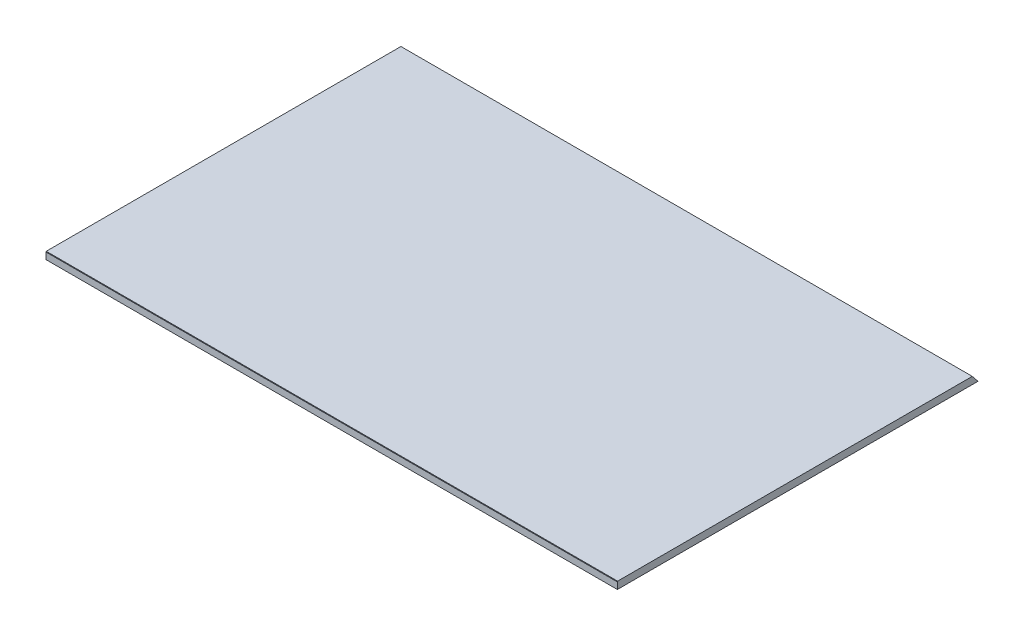
ISO-10303-21;
HEADER;
FILE_DESCRIPTION(('STEP AP214'),'2;1');
FILE_NAME('part.step','',(''),(''),'','','');
FILE_SCHEMA(('AUTOMOTIVE_DESIGN { 1 0 10303 214 1 1 1 1 }'));
ENDSEC;
DATA;
#1=APPLICATION_CONTEXT('core data for automotive mechanical design processes');
#2=APPLICATION_PROTOCOL_DEFINITION('international standard','automotive_design',2000,#1);
#3=PRODUCT_CONTEXT('',#1,'mechanical');
#4=PRODUCT('Part','Part','',(#3));
#5=PRODUCT_RELATED_PRODUCT_CATEGORY('part','',(#4));
#6=PRODUCT_DEFINITION_FORMATION('','',#4);
#7=PRODUCT_DEFINITION_CONTEXT('part definition',#1,'design');
#8=PRODUCT_DEFINITION('design','',#6,#7);
#9=PRODUCT_DEFINITION_SHAPE('','',#8);
#10=(LENGTH_UNIT() NAMED_UNIT(*) SI_UNIT(.MILLI.,.METRE.));
#11=(NAMED_UNIT(*) PLANE_ANGLE_UNIT() SI_UNIT($,.RADIAN.));
#12=(NAMED_UNIT(*) SI_UNIT($,.STERADIAN.) SOLID_ANGLE_UNIT());
#13=UNCERTAINTY_MEASURE_WITH_UNIT(LENGTH_MEASURE(1.E-05),#10,'distance_accuracy_value','');
#14=(GEOMETRIC_REPRESENTATION_CONTEXT(3) GLOBAL_UNCERTAINTY_ASSIGNED_CONTEXT((#13)) GLOBAL_UNIT_ASSIGNED_CONTEXT((#10,
#11,#12)) REPRESENTATION_CONTEXT('',''));
#15=CARTESIAN_POINT('',(0.,0.,0.));
#16=DIRECTION('',(0.,0.,1.));
#17=DIRECTION('',(1.,0.,0.));
#18=AXIS2_PLACEMENT_3D('',#15,#16,#17);
#19=CARTESIAN_POINT('',(-133.,-8.0000000000001,104.1040803328));
#20=DIRECTION('',(-1.,0.,0.));
#21=DIRECTION('',(0.,0.,1.));
#22=AXIS2_PLACEMENT_3D('',#19,#20,#21);
#23=PLANE('',#22);
#24=DIRECTION('',(0.,0.250277466762177,0.968174152532027));
#25=VECTOR('',#24,1.);
#26=CARTESIAN_POINT('',(-133.,-6.12527762073789,103.619455984239));
#27=LINE('',#26,#25);
#28=CARTESIAN_POINT('',(-133.,-8.0000000000001,96.3672739390223));
#29=VERTEX_POINT('',#28);
#30=CARTESIAN_POINT('',(-133.,-6.0000000000001,104.1040803328));
#31=VERTEX_POINT('',#30);
#32=EDGE_CURVE('E469',#29,#31,#27,.T.);
#33=ORIENTED_EDGE('',*,*,#32,.F.);
#34=DIRECTION('',(0.,0.,1.));
#35=VECTOR('',#34,1.);
#36=CARTESIAN_POINT('',(-133.,-8.0000000000001,104.1040803328));
#37=LINE('',#36,#35);
#38=CARTESIAN_POINT('',(-133.,-8.0000000000001,87.3672739390223));
#39=VERTEX_POINT('',#38);
#40=EDGE_CURVE('E293',#39,#29,#37,.T.);
#41=ORIENTED_EDGE('',*,*,#40,.F.);
#42=DIRECTION('',(0.,0.304193173014902,-0.952610368141732));
#43=VECTOR('',#42,1.);
#44=CARTESIAN_POINT('',(-133.,-12.8499510952522,102.55536528416));
#45=LINE('',#44,#43);
#46=CARTESIAN_POINT('',(-133.,-6.0000000000001,81.1040803327998));
#47=VERTEX_POINT('',#46);
#48=EDGE_CURVE('E56',#39,#47,#45,.T.);
#49=ORIENTED_EDGE('',*,*,#48,.T.);
#50=DIRECTION('',(0.,0.,1.));
#51=VECTOR('',#50,1.);
#52=CARTESIAN_POINT('',(-133.,-6.0000000000001,104.1040803328));
#53=LINE('',#52,#51);
#54=EDGE_CURVE('E284',#47,#31,#53,.T.);
#55=ORIENTED_EDGE('',*,*,#54,.T.);
#56=EDGE_LOOP('',(#33,#41,#49,#55));
#57=FACE_BOUND('',#56,.T.);
#58=ADVANCED_FACE('F33',(#57),#23,.F.);
#59=CARTESIAN_POINT('',(-140.,-8.0000000000001,104.1040803328));
#60=DIRECTION('',(1.,0.,0.));
#61=DIRECTION('',(0.,0.,-1.));
#62=AXIS2_PLACEMENT_3D('',#59,#60,#61);
#63=PLANE('',#62);
#64=DIRECTION('',(0.,-0.250277466762177,-0.968174152532027));
#65=VECTOR('',#64,1.);
#66=CARTESIAN_POINT('',(-140.,-6.12527762073789,103.619455984239));
#67=LINE('',#66,#65);
#68=CARTESIAN_POINT('',(-140.,-6.0000000000001,104.1040803328));
#69=VERTEX_POINT('',#68);
#70=CARTESIAN_POINT('',(-140.,-8.0000000000001,96.3672739390223));
#71=VERTEX_POINT('',#70);
#72=EDGE_CURVE('E48',#69,#71,#67,.T.);
#73=ORIENTED_EDGE('',*,*,#72,.F.);
#74=DIRECTION('',(0.,0.,-1.));
#75=VECTOR('',#74,1.);
#76=CARTESIAN_POINT('',(-140.,-6.0000000000001,104.1040803328));
#77=LINE('',#76,#75);
#78=CARTESIAN_POINT('',(-140.,-6.0000000000001,81.1040803327998));
#79=VERTEX_POINT('',#78);
#80=EDGE_CURVE('E305',#69,#79,#77,.T.);
#81=ORIENTED_EDGE('',*,*,#80,.T.);
#82=DIRECTION('',(0.,-0.304193173014902,0.952610368141732));
#83=VECTOR('',#82,1.);
#84=CARTESIAN_POINT('',(-140.,-12.8499510952522,102.55536528416));
#85=LINE('',#84,#83);
#86=CARTESIAN_POINT('',(-140.,-8.0000000000001,87.3672739390223));
#87=VERTEX_POINT('',#86);
#88=EDGE_CURVE('E243',#79,#87,#85,.T.);
#89=ORIENTED_EDGE('',*,*,#88,.T.);
#90=DIRECTION('',(0.,0.,-1.));
#91=VECTOR('',#90,1.);
#92=CARTESIAN_POINT('',(-140.,-8.0000000000001,104.1040803328));
#93=LINE('',#92,#91);
#94=EDGE_CURVE('E296',#71,#87,#93,.T.);
#95=ORIENTED_EDGE('',*,*,#94,.F.);
#96=EDGE_LOOP('',(#73,#81,#89,#95));
#97=FACE_BOUND('',#96,.T.);
#98=ADVANCED_FACE('F503',(#97),#63,.F.);
#99=CARTESIAN_POINT('',(0.,-8.0000000000001,0.));
#100=DIRECTION('',(0.,-1.,0.));
#101=DIRECTION('',(0.,0.,-1.));
#102=AXIS2_PLACEMENT_3D('',#99,#100,#101);
#103=PLANE('',#102);
#104=ORIENTED_EDGE('',*,*,#40,.T.);
#105=DIRECTION('',(-1.,0.,0.));
#106=VECTOR('',#105,1.);
#107=CARTESIAN_POINT('',(160.,-8.0000000000001,96.3672739390223));
#108=LINE('',#107,#106);
#109=EDGE_CURVE('E456',#29,#71,#108,.T.);
#110=ORIENTED_EDGE('',*,*,#109,.T.);
#111=ORIENTED_EDGE('',*,*,#94,.T.);
#112=DIRECTION('',(-1.,0.,0.));
#113=VECTOR('',#112,1.);
#114=CARTESIAN_POINT('',(160.,-8.0000000000001,87.3672739390223));
#115=LINE('',#114,#113);
#116=EDGE_CURVE('E486',#39,#87,#115,.T.);
#117=ORIENTED_EDGE('',*,*,#116,.F.);
#118=EDGE_LOOP('',(#104,#110,#111,#117));
#119=FACE_BOUND('',#118,.T.);
#120=ADVANCED_FACE('F496',(#119),#103,.T.);
#121=CARTESIAN_POINT('',(140.,-8.0000000000001,-37.8959196672003));
#122=DIRECTION('',(-1.,0.,0.));
#123=DIRECTION('',(0.,0.,1.));
#124=AXIS2_PLACEMENT_3D('',#121,#122,#123);
#125=PLANE('',#124);
#126=DIRECTION('',(0.,0.,1.));
#127=VECTOR('',#126,1.);
#128=CARTESIAN_POINT('',(140.,-8.0000000000001,-37.8959196672003));
#129=LINE('',#128,#127);
#130=CARTESIAN_POINT('',(140.,-8.0000000000001,-54.2234138343922));
#131=VERTEX_POINT('',#130);
#132=CARTESIAN_POINT('',(140.,-8.0000000000001,-45.2234138343922));
#133=VERTEX_POINT('',#132);
#134=EDGE_CURVE('E277',#131,#133,#129,.T.);
#135=ORIENTED_EDGE('',*,*,#134,.F.);
#136=DIRECTION('',(0.,0.287117162806241,-0.957895471761974));
#137=VECTOR('',#136,1.);
#138=CARTESIAN_POINT('',(140.,-12.4905218230525,-39.2418973060576));
#139=LINE('',#138,#137);
#140=CARTESIAN_POINT('',(140.,-6.0000000000001,-60.8959196672003));
#141=VERTEX_POINT('',#140);
#142=EDGE_CURVE('E249',#131,#141,#139,.T.);
#143=ORIENTED_EDGE('',*,*,#142,.T.);
#144=DIRECTION('',(0.,0.,1.));
#145=VECTOR('',#144,1.);
#146=CARTESIAN_POINT('',(140.,-6.0000000000001,-37.8959196672003));
#147=LINE('',#146,#145);
#148=CARTESIAN_POINT('',(140.,-6.0000000000001,-37.8959196672003));
#149=VERTEX_POINT('',#148);
#150=EDGE_CURVE('E267',#141,#149,#147,.T.);
#151=ORIENTED_EDGE('',*,*,#150,.T.);
#152=DIRECTION('',(0.,0.263312547903878,0.964710579457056));
#153=VECTOR('',#152,1.);
#154=CARTESIAN_POINT('',(140.,-6.13866699576736,-38.4039604685336));
#155=LINE('',#154,#153);
#156=EDGE_CURVE('E436',#133,#149,#155,.T.);
#157=ORIENTED_EDGE('',*,*,#156,.F.);
#158=EDGE_LOOP('',(#135,#143,#151,#157));
#159=FACE_BOUND('',#158,.T.);
#160=ADVANCED_FACE('F494',(#159),#125,.F.);
#161=CARTESIAN_POINT('',(133.,-8.0000000000001,-37.8959196672003));
#162=DIRECTION('',(1.,0.,0.));
#163=DIRECTION('',(0.,0.,-1.));
#164=AXIS2_PLACEMENT_3D('',#161,#162,#163);
#165=PLANE('',#164);
#166=DIRECTION('',(0.,0.,-1.));
#167=VECTOR('',#166,1.);
#168=CARTESIAN_POINT('',(133.,-6.0000000000001,-37.8959196672003));
#169=LINE('',#168,#167);
#170=CARTESIAN_POINT('',(133.,-6.0000000000001,-37.8959196672003));
#171=VERTEX_POINT('',#170);
#172=CARTESIAN_POINT('',(133.,-6.0000000000001,-60.8959196672003));
#173=VERTEX_POINT('',#172);
#174=EDGE_CURVE('E289',#171,#173,#169,.T.);
#175=ORIENTED_EDGE('',*,*,#174,.T.);
#176=DIRECTION('',(0.,-0.287117162806241,0.957895471761974));
#177=VECTOR('',#176,1.);
#178=CARTESIAN_POINT('',(133.,-12.4905218230525,-39.2418973060576));
#179=LINE('',#178,#177);
#180=CARTESIAN_POINT('',(133.,-8.0000000000001,-54.2234138343922));
#181=VERTEX_POINT('',#180);
#182=EDGE_CURVE('E253',#173,#181,#179,.T.);
#183=ORIENTED_EDGE('',*,*,#182,.T.);
#184=DIRECTION('',(0.,0.,-1.));
#185=VECTOR('',#184,1.);
#186=CARTESIAN_POINT('',(133.,-8.0000000000001,-37.8959196672003));
#187=LINE('',#186,#185);
#188=CARTESIAN_POINT('',(133.,-8.0000000000001,-45.2234138343922));
#189=VERTEX_POINT('',#188);
#190=EDGE_CURVE('E280',#189,#181,#187,.T.);
#191=ORIENTED_EDGE('',*,*,#190,.F.);
#192=DIRECTION('',(0.,-0.263312547903878,-0.964710579457056));
#193=VECTOR('',#192,1.);
#194=CARTESIAN_POINT('',(133.,-6.13866699576736,-38.4039604685336));
#195=LINE('',#194,#193);
#196=EDGE_CURVE('E440',#171,#189,#195,.T.);
#197=ORIENTED_EDGE('',*,*,#196,.F.);
#198=EDGE_LOOP('',(#175,#183,#191,#197));
#199=FACE_BOUND('',#198,.T.);
#200=ADVANCED_FACE('F487',(#199),#165,.F.);
#201=CARTESIAN_POINT('',(0.,-8.0000000000001,0.));
#202=DIRECTION('',(0.,1.,0.));
#203=DIRECTION('',(0.,0.,1.));
#204=AXIS2_PLACEMENT_3D('',#201,#202,#203);
#205=PLANE('',#204);
#206=ORIENTED_EDGE('',*,*,#190,.T.);
#207=DIRECTION('',(-1.,0.,0.));
#208=VECTOR('',#207,1.);
#209=CARTESIAN_POINT('',(160.,-8.0000000000001,-54.2234138343922));
#210=LINE('',#209,#208);
#211=EDGE_CURVE('E454',#131,#181,#210,.T.);
#212=ORIENTED_EDGE('',*,*,#211,.F.);
#213=ORIENTED_EDGE('',*,*,#134,.T.);
#214=DIRECTION('',(-1.,0.,0.));
#215=VECTOR('',#214,1.);
#216=CARTESIAN_POINT('',(160.,-8.0000000000001,-45.2234138343922));
#217=LINE('',#216,#215);
#218=EDGE_CURVE('E459',#133,#189,#217,.T.);
#219=ORIENTED_EDGE('',*,*,#218,.T.);
#220=EDGE_LOOP('',(#206,#212,#213,#219));
#221=FACE_BOUND('',#220,.T.);
#222=ADVANCED_FACE('F483',(#221),#205,.F.);
#223=CARTESIAN_POINT('',(-133.,-8.0000000000001,-37.8959196672003));
#224=DIRECTION('',(-1.,0.,0.));
#225=DIRECTION('',(0.,0.,1.));
#226=AXIS2_PLACEMENT_3D('',#223,#224,#225);
#227=PLANE('',#226);
#228=DIRECTION('',(0.,0.,1.));
#229=VECTOR('',#228,1.);
#230=CARTESIAN_POINT('',(-133.,-8.0000000000001,-37.8959196672003));
#231=LINE('',#230,#229);
#232=CARTESIAN_POINT('',(-133.,-8.0000000000001,-54.2234138343922));
#233=VERTEX_POINT('',#232);
#234=CARTESIAN_POINT('',(-133.,-8.0000000000001,-45.2234138343922));
#235=VERTEX_POINT('',#234);
#236=EDGE_CURVE('E260',#233,#235,#231,.T.);
#237=ORIENTED_EDGE('',*,*,#236,.F.);
#238=DIRECTION('',(0.,0.287117162806241,-0.957895471761974));
#239=VECTOR('',#238,1.);
#240=CARTESIAN_POINT('',(-133.,-12.4905218230525,-39.2418973060576));
#241=LINE('',#240,#239);
#242=CARTESIAN_POINT('',(-133.,-6.0000000000001,-60.8959196672003));
#243=VERTEX_POINT('',#242);
#244=EDGE_CURVE('E435',#233,#243,#241,.T.);
#245=ORIENTED_EDGE('',*,*,#244,.T.);
#246=DIRECTION('',(0.,0.,1.));
#247=VECTOR('',#246,1.);
#248=CARTESIAN_POINT('',(-133.,-6.0000000000001,-37.8959196672003));
#249=LINE('',#248,#247);
#250=CARTESIAN_POINT('',(-133.,-6.0000000000001,-37.8959196672003));
#251=VERTEX_POINT('',#250);
#252=EDGE_CURVE('E268',#243,#251,#249,.T.);
#253=ORIENTED_EDGE('',*,*,#252,.T.);
#254=DIRECTION('',(0.,0.263312547903878,0.964710579457056));
#255=VECTOR('',#254,1.);
#256=CARTESIAN_POINT('',(-133.,-6.13866699576736,-38.4039604685336));
#257=LINE('',#256,#255);
#258=EDGE_CURVE('E472',#235,#251,#257,.T.);
#259=ORIENTED_EDGE('',*,*,#258,.F.);
#260=EDGE_LOOP('',(#237,#245,#253,#259));
#261=FACE_BOUND('',#260,.T.);
#262=ADVANCED_FACE('F719',(#261),#227,.F.);
#263=CARTESIAN_POINT('',(-140.,-8.0000000000001,-37.8959196672003));
#264=DIRECTION('',(1.,0.,0.));
#265=DIRECTION('',(0.,0.,-1.));
#266=AXIS2_PLACEMENT_3D('',#263,#264,#265);
#267=PLANE('',#266);
#268=DIRECTION('',(0.,0.,-1.));
#269=VECTOR('',#268,1.);
#270=CARTESIAN_POINT('',(-140.,-6.0000000000001,-37.8959196672003));
#271=LINE('',#270,#269);
#272=CARTESIAN_POINT('',(-140.,-6.0000000000001,-37.8959196672003));
#273=VERTEX_POINT('',#272);
#274=CARTESIAN_POINT('',(-140.,-6.0000000000001,-60.8959196672003));
#275=VERTEX_POINT('',#274);
#276=EDGE_CURVE('E273',#273,#275,#271,.T.);
#277=ORIENTED_EDGE('',*,*,#276,.T.);
#278=DIRECTION('',(0.,-0.287117162806241,0.957895471761974));
#279=VECTOR('',#278,1.);
#280=CARTESIAN_POINT('',(-140.,-12.4905218230525,-39.2418973060576));
#281=LINE('',#280,#279);
#282=CARTESIAN_POINT('',(-140.,-8.0000000000001,-54.2234138343922));
#283=VERTEX_POINT('',#282);
#284=EDGE_CURVE('E432',#275,#283,#281,.T.);
#285=ORIENTED_EDGE('',*,*,#284,.T.);
#286=DIRECTION('',(0.,0.,-1.));
#287=VECTOR('',#286,1.);
#288=CARTESIAN_POINT('',(-140.,-8.0000000000001,-37.8959196672003));
#289=LINE('',#288,#287);
#290=CARTESIAN_POINT('',(-140.,-8.0000000000001,-45.2234138343922));
#291=VERTEX_POINT('',#290);
#292=EDGE_CURVE('E263',#291,#283,#289,.T.);
#293=ORIENTED_EDGE('',*,*,#292,.F.);
#294=DIRECTION('',(0.,-0.263312547903878,-0.964710579457056));
#295=VECTOR('',#294,1.);
#296=CARTESIAN_POINT('',(-140.,-6.13866699576736,-38.4039604685336));
#297=LINE('',#296,#295);
#298=EDGE_CURVE('E430',#273,#291,#297,.T.);
#299=ORIENTED_EDGE('',*,*,#298,.F.);
#300=EDGE_LOOP('',(#277,#285,#293,#299));
#301=FACE_BOUND('',#300,.T.);
#302=ADVANCED_FACE('F429',(#301),#267,.F.);
#303=CARTESIAN_POINT('',(0.,-8.0000000000001,0.));
#304=DIRECTION('',(0.,-1.,0.));
#305=DIRECTION('',(0.,0.,-1.));
#306=AXIS2_PLACEMENT_3D('',#303,#304,#305);
#307=PLANE('',#306);
#308=DIRECTION('',(-1.,0.,0.));
#309=VECTOR('',#308,1.);
#310=CARTESIAN_POINT('',(0.,-8.0000000000001,-54.2234138343922));
#311=LINE('',#310,#309);
#312=EDGE_CURVE('E11',#233,#283,#311,.T.);
#313=ORIENTED_EDGE('',*,*,#312,.F.);
#314=ORIENTED_EDGE('',*,*,#236,.T.);
#315=DIRECTION('',(-1.,0.,0.));
#316=VECTOR('',#315,1.);
#317=CARTESIAN_POINT('',(0.,-8.0000000000001,-45.2234138343922));
#318=LINE('',#317,#316);
#319=EDGE_CURVE('E41',#235,#291,#318,.T.);
#320=ORIENTED_EDGE('',*,*,#319,.T.);
#321=ORIENTED_EDGE('',*,*,#292,.T.);
#322=EDGE_LOOP('',(#313,#314,#320,#321));
#323=FACE_BOUND('',#322,.T.);
#324=ADVANCED_FACE('F422',(#323),#307,.T.);
#325=CARTESIAN_POINT('',(140.,-8.0000000000001,104.1040803328));
#326=DIRECTION('',(-1.,0.,0.));
#327=DIRECTION('',(0.,0.,1.));
#328=AXIS2_PLACEMENT_3D('',#325,#326,#327);
#329=PLANE('',#328);
#330=DIRECTION('',(0.,0.250277466762177,0.968174152532027));
#331=VECTOR('',#330,1.);
#332=CARTESIAN_POINT('',(140.,-6.12527762073789,103.619455984239));
#333=LINE('',#332,#331);
#334=CARTESIAN_POINT('',(140.,-8.0000000000001,96.3672739390223));
#335=VERTEX_POINT('',#334);
#336=CARTESIAN_POINT('',(140.,-6.0000000000001,104.1040803328));
#337=VERTEX_POINT('',#336);
#338=EDGE_CURVE('E466',#335,#337,#333,.T.);
#339=ORIENTED_EDGE('',*,*,#338,.F.);
#340=DIRECTION('',(0.,0.,1.));
#341=VECTOR('',#340,1.);
#342=CARTESIAN_POINT('',(140.,-8.0000000000001,104.1040803328));
#343=LINE('',#342,#341);
#344=CARTESIAN_POINT('',(140.,-8.0000000000001,87.3672739390223));
#345=VERTEX_POINT('',#344);
#346=EDGE_CURVE('E233',#345,#335,#343,.T.);
#347=ORIENTED_EDGE('',*,*,#346,.F.);
#348=DIRECTION('',(0.,0.304193173014902,-0.952610368141732));
#349=VECTOR('',#348,1.);
#350=CARTESIAN_POINT('',(140.,-12.8499510952522,102.55536528416));
#351=LINE('',#350,#349);
#352=CARTESIAN_POINT('',(140.,-6.0000000000001,81.1040803327998));
#353=VERTEX_POINT('',#352);
#354=EDGE_CURVE('E225',#345,#353,#351,.T.);
#355=ORIENTED_EDGE('',*,*,#354,.T.);
#356=DIRECTION('',(0.,0.,1.));
#357=VECTOR('',#356,1.);
#358=CARTESIAN_POINT('',(140.,-6.0000000000001,104.1040803328));
#359=LINE('',#358,#357);
#360=EDGE_CURVE('E241',#353,#337,#359,.T.);
#361=ORIENTED_EDGE('',*,*,#360,.T.);
#362=EDGE_LOOP('',(#339,#347,#355,#361));
#363=FACE_BOUND('',#362,.T.);
#364=ADVANCED_FACE('F240',(#363),#329,.F.);
#365=CARTESIAN_POINT('',(133.,-8.0000000000001,104.1040803328));
#366=DIRECTION('',(1.,0.,0.));
#367=DIRECTION('',(0.,0.,-1.));
#368=AXIS2_PLACEMENT_3D('',#365,#366,#367);
#369=PLANE('',#368);
#370=DIRECTION('',(0.,-0.250277466762177,-0.968174152532027));
#371=VECTOR('',#370,1.);
#372=CARTESIAN_POINT('',(133.,-6.12527762073789,103.619455984239));
#373=LINE('',#372,#371);
#374=CARTESIAN_POINT('',(133.,-6.0000000000001,104.1040803328));
#375=VERTEX_POINT('',#374);
#376=CARTESIAN_POINT('',(133.,-8.0000000000001,96.3672739390223));
#377=VERTEX_POINT('',#376);
#378=EDGE_CURVE('E453',#375,#377,#373,.T.);
#379=ORIENTED_EDGE('',*,*,#378,.F.);
#380=DIRECTION('',(0.,0.,-1.));
#381=VECTOR('',#380,1.);
#382=CARTESIAN_POINT('',(133.,-6.0000000000001,104.1040803328));
#383=LINE('',#382,#381);
#384=CARTESIAN_POINT('',(133.,-6.0000000000001,81.1040803327998));
#385=VERTEX_POINT('',#384);
#386=EDGE_CURVE('E234',#375,#385,#383,.T.);
#387=ORIENTED_EDGE('',*,*,#386,.T.);
#388=DIRECTION('',(0.,-0.304193173014902,0.952610368141732));
#389=VECTOR('',#388,1.);
#390=CARTESIAN_POINT('',(133.,-12.8499510952522,102.55536528416));
#391=LINE('',#390,#389);
#392=CARTESIAN_POINT('',(133.,-8.0000000000001,87.3672739390223));
#393=VERTEX_POINT('',#392);
#394=EDGE_CURVE('E228',#385,#393,#391,.T.);
#395=ORIENTED_EDGE('',*,*,#394,.T.);
#396=DIRECTION('',(0.,0.,-1.));
#397=VECTOR('',#396,1.);
#398=CARTESIAN_POINT('',(133.,-8.0000000000001,104.1040803328));
#399=LINE('',#398,#397);
#400=EDGE_CURVE('E256',#377,#393,#399,.T.);
#401=ORIENTED_EDGE('',*,*,#400,.F.);
#402=EDGE_LOOP('',(#379,#387,#395,#401));
#403=FACE_BOUND('',#402,.T.);
#404=ADVANCED_FACE('F452',(#403),#369,.F.);
#405=CARTESIAN_POINT('',(0.,-8.0000000000001,0.));
#406=DIRECTION('',(0.,1.,0.));
#407=DIRECTION('',(0.,0.,1.));
#408=AXIS2_PLACEMENT_3D('',#405,#406,#407);
#409=PLANE('',#408);
#410=DIRECTION('',(1.,0.,0.));
#411=VECTOR('',#410,1.);
#412=CARTESIAN_POINT('',(0.,-8.0000000000001,96.3672739390223));
#413=LINE('',#412,#411);
#414=EDGE_CURVE('E417',#377,#335,#413,.T.);
#415=ORIENTED_EDGE('',*,*,#414,.F.);
#416=ORIENTED_EDGE('',*,*,#400,.T.);
#417=DIRECTION('',(1.,0.,0.));
#418=VECTOR('',#417,1.);
#419=CARTESIAN_POINT('',(0.,-8.0000000000001,87.3672739390223));
#420=LINE('',#419,#418);
#421=EDGE_CURVE('E415',#393,#345,#420,.T.);
#422=ORIENTED_EDGE('',*,*,#421,.T.);
#423=ORIENTED_EDGE('',*,*,#346,.T.);
#424=EDGE_LOOP('',(#415,#416,#422,#423));
#425=FACE_BOUND('',#424,.T.);
#426=ADVANCED_FACE('F449',(#425),#409,.F.);
#427=CARTESIAN_POINT('',(160.,-6.0000000000001,88.1040803327998));
#428=DIRECTION('',(0.,1.,0.));
#429=DIRECTION('',(0.,0.,1.));
#430=AXIS2_PLACEMENT_3D('',#427,#428,#429);
#431=PLANE('',#430);
#432=DIRECTION('',(1.,0.,0.));
#433=VECTOR('',#432,1.);
#434=CARTESIAN_POINT('',(-140.,-6.0000000000001,-60.8959196672003));
#435=LINE('',#434,#433);
#436=EDGE_CURVE('E264',#275,#243,#435,.T.);
#437=ORIENTED_EDGE('',*,*,#436,.F.);
#438=ORIENTED_EDGE('',*,*,#276,.F.);
#439=DIRECTION('',(-1.,0.,0.));
#440=VECTOR('',#439,1.);
#441=CARTESIAN_POINT('',(-140.,-6.0000000000001,-37.8959196672003));
#442=LINE('',#441,#440);
#443=EDGE_CURVE('E271',#251,#273,#442,.T.);
#444=ORIENTED_EDGE('',*,*,#443,.F.);
#445=ORIENTED_EDGE('',*,*,#252,.F.);
#446=EDGE_LOOP('',(#437,#438,#444,#445));
#447=FACE_BOUND('',#446,.T.);
#448=DIRECTION('',(1.,0.,0.));
#449=VECTOR('',#448,1.);
#450=CARTESIAN_POINT('',(140.,-6.0000000000001,-60.8959196672003));
#451=LINE('',#450,#449);
#452=EDGE_CURVE('E281',#173,#141,#451,.T.);
#453=ORIENTED_EDGE('',*,*,#452,.F.);
#454=ORIENTED_EDGE('',*,*,#174,.F.);
#455=DIRECTION('',(-1.,0.,0.));
#456=VECTOR('',#455,1.);
#457=CARTESIAN_POINT('',(140.,-6.0000000000001,-37.8959196672003));
#458=LINE('',#457,#456);
#459=EDGE_CURVE('E287',#149,#171,#458,.T.);
#460=ORIENTED_EDGE('',*,*,#459,.F.);
#461=ORIENTED_EDGE('',*,*,#150,.F.);
#462=EDGE_LOOP('',(#453,#454,#460,#461));
#463=FACE_BOUND('',#462,.T.);
#464=DIRECTION('',(-1.,0.,0.));
#465=VECTOR('',#464,1.);
#466=CARTESIAN_POINT('',(140.,-6.0000000000001,104.1040803328));
#467=LINE('',#466,#465);
#468=EDGE_CURVE('E248',#337,#375,#467,.T.);
#469=ORIENTED_EDGE('',*,*,#468,.F.);
#470=ORIENTED_EDGE('',*,*,#360,.F.);
#471=DIRECTION('',(1.,0.,0.));
#472=VECTOR('',#471,1.);
#473=CARTESIAN_POINT('',(140.,-6.0000000000001,81.1040803327998));
#474=LINE('',#473,#472);
#475=EDGE_CURVE('E222',#385,#353,#474,.T.);
#476=ORIENTED_EDGE('',*,*,#475,.F.);
#477=ORIENTED_EDGE('',*,*,#386,.F.);
#478=EDGE_LOOP('',(#469,#470,#476,#477));
#479=FACE_BOUND('',#478,.T.);
#480=DIRECTION('',(-1.,0.,0.));
#481=VECTOR('',#480,1.);
#482=CARTESIAN_POINT('',(-140.,-6.0000000000001,104.1040803328));
#483=LINE('',#482,#481);
#484=EDGE_CURVE('E303',#31,#69,#483,.T.);
#485=ORIENTED_EDGE('',*,*,#484,.F.);
#486=ORIENTED_EDGE('',*,*,#54,.F.);
#487=DIRECTION('',(1.,0.,0.));
#488=VECTOR('',#487,1.);
#489=CARTESIAN_POINT('',(-140.,-6.0000000000001,81.1040803327998));
#490=LINE('',#489,#488);
#491=EDGE_CURVE('E297',#79,#47,#490,.T.);
#492=ORIENTED_EDGE('',*,*,#491,.F.);
#493=ORIENTED_EDGE('',*,*,#80,.F.);
#494=EDGE_LOOP('',(#485,#486,#492,#493));
#495=FACE_BOUND('',#494,.T.);
#496=DIRECTION('',(-1.,0.,0.));
#497=VECTOR('',#496,1.);
#498=CARTESIAN_POINT('',(160.,-6.0000000000001,106.1040803328));
#499=LINE('',#498,#497);
#500=CARTESIAN_POINT('',(142.,-6.00000000000008,106.1040803328));
#501=VERTEX_POINT('',#500);
#502=CARTESIAN_POINT('',(-142.,-6.0000000000001,106.1040803328));
#503=VERTEX_POINT('',#502);
#504=EDGE_CURVE('E392',#501,#503,#499,.T.);
#505=ORIENTED_EDGE('',*,*,#504,.T.);
#506=DIRECTION('',(0.,0.,1.));
#507=VECTOR('',#506,1.);
#508=CARTESIAN_POINT('',(-142.,-6.0000000000001,-82.7813178460502));
#509=LINE('',#508,#507);
#510=CARTESIAN_POINT('',(-142.,-6.0000000000001,-62.8959196671999));
#511=VERTEX_POINT('',#510);
#512=EDGE_CURVE('E341',#511,#503,#509,.T.);
#513=ORIENTED_EDGE('',*,*,#512,.F.);
#514=DIRECTION('',(-1.,0.,0.));
#515=VECTOR('',#514,1.);
#516=CARTESIAN_POINT('',(160.,-6.0000000000001,-62.8959196672002));
#517=LINE('',#516,#515);
#518=CARTESIAN_POINT('',(142.,-6.00000000000008,-62.8959196672003));
#519=VERTEX_POINT('',#518);
#520=EDGE_CURVE('E389',#519,#511,#517,.T.);
#521=ORIENTED_EDGE('',*,*,#520,.F.);
#522=DIRECTION('',(0.,0.,1.));
#523=VECTOR('',#522,1.);
#524=CARTESIAN_POINT('',(142.,-6.00000000000008,-82.7813178460502));
#525=LINE('',#524,#523);
#526=EDGE_CURVE('E333',#519,#501,#525,.T.);
#527=ORIENTED_EDGE('',*,*,#526,.T.);
#528=EDGE_LOOP('',(#505,#513,#521,#527));
#529=FACE_BOUND('',#528,.T.);
#530=DIRECTION('',(-1.,0.,0.));
#531=VECTOR('',#530,1.);
#532=CARTESIAN_POINT('',(-115.,-6.0000000000001,-17.8959196672002));
#533=LINE('',#532,#531);
#534=CARTESIAN_POINT('',(118.,-6.0000000000001,-17.8959196672002));
#535=VERTEX_POINT('',#534);
#536=CARTESIAN_POINT('',(-115.,-6.0000000000001,-17.8959196672002));
#537=VERTEX_POINT('',#536);
#538=EDGE_CURVE('E324',#535,#537,#533,.T.);
#539=ORIENTED_EDGE('',*,*,#538,.F.);
#540=DIRECTION('',(0.,0.,1.));
#541=VECTOR('',#540,1.);
#542=CARTESIAN_POINT('',(118.,-6.0000000000001,-17.8959196672002));
#543=LINE('',#542,#541);
#544=CARTESIAN_POINT('',(118.,-6.0000000000001,-38.8959196672002));
#545=VERTEX_POINT('',#544);
#546=EDGE_CURVE('E300',#545,#535,#543,.T.);
#547=ORIENTED_EDGE('',*,*,#546,.F.);
#548=DIRECTION('',(1.,0.,0.));
#549=VECTOR('',#548,1.);
#550=CARTESIAN_POINT('',(-115.,-6.0000000000001,-38.8959196672002));
#551=LINE('',#550,#549);
#552=CARTESIAN_POINT('',(-115.,-6.0000000000001,-38.8959196672002));
#553=VERTEX_POINT('',#552);
#554=EDGE_CURVE('E313',#553,#545,#551,.T.);
#555=ORIENTED_EDGE('',*,*,#554,.F.);
#556=DIRECTION('',(0.,0.,-1.));
#557=VECTOR('',#556,1.);
#558=CARTESIAN_POINT('',(-115.,-6.0000000000001,-17.8959196672002));
#559=LINE('',#558,#557);
#560=EDGE_CURVE('E327',#537,#553,#559,.T.);
#561=ORIENTED_EDGE('',*,*,#560,.F.);
#562=EDGE_LOOP('',(#539,#547,#555,#561));
#563=FACE_BOUND('',#562,.T.);
#564=ADVANCED_FACE('F246',(#447,#463,#479,#495,#529,#563),#431,.F.);
#565=CARTESIAN_POINT('',(160.,-2.99847261079059,-80.976403783546));
#566=DIRECTION('',(0.,0.411505311812501,0.911407361364882));
#567=DIRECTION('',(0.,-0.911407361364882,0.411505311812501));
#568=AXIS2_PLACEMENT_3D('',#565,#566,#567);
#569=PLANE('',#568);
#570=DIRECTION('',(-1.,0.,0.));
#571=VECTOR('',#570,1.);
#572=CARTESIAN_POINT('',(160.,-3.17672988719719,-80.8959196672002));
#573=LINE('',#572,#571);
#574=CARTESIAN_POINT('',(148.353193653414,-3.17672988719719,-80.8959196672002));
#575=VERTEX_POINT('',#574);
#576=CARTESIAN_POINT('',(-148.353193653414,-3.17672988719719,-80.8959196672002));
#577=VERTEX_POINT('',#576);
#578=EDGE_CURVE('E379',#575,#577,#573,.T.);
#579=ORIENTED_EDGE('',*,*,#578,.T.);
#580=DIRECTION('',(-0.898847314700214,0.399435134202546,-0.180347105385164));
#581=VECTOR('',#580,1.);
#582=CARTESIAN_POINT('',(100.696474599567,-113.850907842446,-30.9259347409607));
#583=LINE('',#582,#581);
#584=CARTESIAN_POINT('',(-157.749990383701,0.999074725723093,-82.7813178460502));
#585=VERTEX_POINT('',#584);
#586=EDGE_CURVE('E347',#577,#585,#583,.T.);
#587=ORIENTED_EDGE('',*,*,#586,.T.);
#588=DIRECTION('',(-1.,0.,0.));
#589=VECTOR('',#588,1.);
#590=CARTESIAN_POINT('',(160.,0.999074725723074,-82.7813178460502));
#591=LINE('',#590,#589);
#592=CARTESIAN_POINT('',(157.749990383701,0.999074725723073,-82.7813178460502));
#593=VERTEX_POINT('',#592);
#594=EDGE_CURVE('E407',#593,#585,#591,.T.);
#595=ORIENTED_EDGE('',*,*,#594,.F.);
#596=DIRECTION('',(-0.898847314700214,-0.399435134202546,0.180347105385164));
#597=VECTOR('',#596,1.);
#598=CARTESIAN_POINT('',(157.840003846445,1.03907544551512,-82.7993783855724));
#599=LINE('',#598,#597);
#600=EDGE_CURVE('E359',#593,#575,#599,.T.);
#601=ORIENTED_EDGE('',*,*,#600,.T.);
#602=EDGE_LOOP('',(#579,#587,#595,#601));
#603=FACE_BOUND('',#602,.T.);
#604=ADVANCED_FACE('F35',(#603),#569,.F.);
#605=CARTESIAN_POINT('',(160.,5.99907472572326,-78.7813178460504));
#606=DIRECTION('',(0.,-0.624695047554385,0.780868809443061));
#607=DIRECTION('',(0.,-0.780868809443061,-0.624695047554385));
#608=AXIS2_PLACEMENT_3D('',#605,#606,#607);
#609=PLANE('',#608);
#610=ORIENTED_EDGE('',*,*,#594,.T.);
#611=DIRECTION('',(-0.869116685727033,0.386223259861252,0.30897860788897));
#612=VECTOR('',#611,1.);
#613=CARTESIAN_POINT('',(79.5143348108469,-104.437862143994,-167.130867341815));
#614=LINE('',#613,#612);
#615=CARTESIAN_POINT('',(-160.,1.99894742751022,-81.9814196846205));
#616=VERTEX_POINT('',#615);
#617=EDGE_CURVE('E350',#585,#616,#614,.T.);
#618=ORIENTED_EDGE('',*,*,#617,.T.);
#619=DIRECTION('',(0.,0.780868809443061,0.624695047554385));
#620=VECTOR('',#619,1.);
#621=CARTESIAN_POINT('',(-160.,5.99907472572326,-78.7813178460504));
#622=LINE('',#621,#620);
#623=CARTESIAN_POINT('',(-160.,5.99907472572326,-78.7813178460504));
#624=VERTEX_POINT('',#623);
#625=EDGE_CURVE('E368',#616,#624,#622,.T.);
#626=ORIENTED_EDGE('',*,*,#625,.T.);
#627=DIRECTION('',(-1.,0.,0.));
#628=VECTOR('',#627,1.);
#629=CARTESIAN_POINT('',(160.,5.99907472572326,-78.7813178460504));
#630=LINE('',#629,#628);
#631=CARTESIAN_POINT('',(160.,5.99907472572326,-78.7813178460504));
#632=VERTEX_POINT('',#631);
#633=EDGE_CURVE('E404',#632,#624,#630,.T.);
#634=ORIENTED_EDGE('',*,*,#633,.F.);
#635=DIRECTION('',(0.,0.780868809443061,0.624695047554385));
#636=VECTOR('',#635,1.);
#637=CARTESIAN_POINT('',(160.,5.99907472572326,-78.7813178460504));
#638=LINE('',#637,#636);
#639=CARTESIAN_POINT('',(160.,1.99894742751023,-81.9814196846205));
#640=VERTEX_POINT('',#639);
#641=EDGE_CURVE('E369',#640,#632,#638,.T.);
#642=ORIENTED_EDGE('',*,*,#641,.F.);
#643=DIRECTION('',(-0.869116685727033,-0.386223259861252,-0.30897860788897));
#644=VECTOR('',#643,1.);
#645=CARTESIAN_POINT('',(162.202085480078,2.97752331562306,-81.1985589741303));
#646=LINE('',#645,#644);
#647=EDGE_CURVE('E362',#640,#593,#646,.T.);
#648=ORIENTED_EDGE('',*,*,#647,.T.);
#649=EDGE_LOOP('',(#610,#618,#626,#634,#642,#648));
#650=FACE_BOUND('',#649,.T.);
#651=ADVANCED_FACE('F574',(#650),#609,.F.);
#652=CARTESIAN_POINT('',(160.,5.9999999999998,119.8560414503));
#653=DIRECTION('',(0.,-0.999999999989151,4.65810802062814E-06));
#654=DIRECTION('',(0.,-4.65810802062814E-06,-0.999999999989151));
#655=AXIS2_PLACEMENT_3D('',#652,#653,#654);
#656=PLANE('',#655);
#657=DIRECTION('',(0.,4.65810802062814E-06,0.999999999989151));
#658=VECTOR('',#657,1.);
#659=CARTESIAN_POINT('',(-160.,5.9999999999998,119.8560414503));
#660=LINE('',#659,#658);
#661=CARTESIAN_POINT('',(-160.,5.9999999999998,119.8560414503));
#662=VERTEX_POINT('',#661);
#663=EDGE_CURVE('E381',#624,#662,#660,.T.);
#664=ORIENTED_EDGE('',*,*,#663,.T.);
#665=DIRECTION('',(-1.,0.,0.));
#666=VECTOR('',#665,1.);
#667=CARTESIAN_POINT('',(160.,5.9999999999998,119.8560414503));
#668=LINE('',#667,#666);
#669=CARTESIAN_POINT('',(160.,5.9999999999998,119.8560414503));
#670=VERTEX_POINT('',#669);
#671=EDGE_CURVE('E401',#670,#662,#668,.T.);
#672=ORIENTED_EDGE('',*,*,#671,.F.);
#673=DIRECTION('',(0.,4.65810802062814E-06,0.999999999989151));
#674=VECTOR('',#673,1.);
#675=CARTESIAN_POINT('',(160.,5.9999999999998,119.8560414503));
#676=LINE('',#675,#674);
#677=EDGE_CURVE('E371',#632,#670,#676,.T.);
#678=ORIENTED_EDGE('',*,*,#677,.F.);
#679=ORIENTED_EDGE('',*,*,#633,.T.);
#680=EDGE_LOOP('',(#664,#672,#678,#679));
#681=FACE_BOUND('',#680,.T.);
#682=ADVANCED_FACE('F571',(#681),#656,.F.);
#683=CARTESIAN_POINT('',(160.,5.6799999999998,120.));
#684=DIRECTION('',(0.,-0.410266438845355,-0.911965706129979));
#685=DIRECTION('',(0.,0.911965706129979,-0.410266438845355));
#686=AXIS2_PLACEMENT_3D('',#683,#684,#685);
#687=PLANE('',#686);
#688=DIRECTION('',(0.,-0.911965706129979,0.410266438845355));
#689=VECTOR('',#688,1.);
#690=CARTESIAN_POINT('',(-160.,5.6799999999998,120.));
#691=LINE('',#690,#689);
#692=CARTESIAN_POINT('',(-160.,5.6799999999998,120.));
#693=VERTEX_POINT('',#692);
#694=EDGE_CURVE('E383',#662,#693,#691,.T.);
#695=ORIENTED_EDGE('',*,*,#694,.T.);
#696=DIRECTION('',(-1.,0.,0.));
#697=VECTOR('',#696,1.);
#698=CARTESIAN_POINT('',(160.,5.6799999999998,120.));
#699=LINE('',#698,#697);
#700=CARTESIAN_POINT('',(160.,5.6799999999998,120.));
#701=VERTEX_POINT('',#700);
#702=EDGE_CURVE('E398',#701,#693,#699,.T.);
#703=ORIENTED_EDGE('',*,*,#702,.F.);
#704=DIRECTION('',(0.,-0.911965706129979,0.410266438845355));
#705=VECTOR('',#704,1.);
#706=CARTESIAN_POINT('',(160.,5.6799999999998,120.));
#707=LINE('',#706,#705);
#708=EDGE_CURVE('E374',#670,#701,#707,.T.);
#709=ORIENTED_EDGE('',*,*,#708,.F.);
#710=ORIENTED_EDGE('',*,*,#671,.T.);
#711=EDGE_LOOP('',(#695,#703,#709,#710));
#712=FACE_BOUND('',#711,.T.);
#713=ADVANCED_FACE('F567',(#712),#687,.F.);
#714=CARTESIAN_POINT('',(160.,5.6799999999998,120.));
#715=DIRECTION('',(0.,0.,-1.));
#716=DIRECTION('',(-1.,0.,0.));
#717=AXIS2_PLACEMENT_3D('',#714,#715,#716);
#718=PLANE('',#717);
#719=DIRECTION('',(0.,-1.,0.));
#720=VECTOR('',#719,1.);
#721=CARTESIAN_POINT('',(-160.,5.6799999999998,120.));
#722=LINE('',#721,#720);
#723=CARTESIAN_POINT('',(-160.,1.99894742751022,120.));
#724=VERTEX_POINT('',#723);
#725=EDGE_CURVE('E372',#693,#724,#722,.T.);
#726=ORIENTED_EDGE('',*,*,#725,.T.);
#727=DIRECTION('',(-1.,0.,0.));
#728=VECTOR('',#727,1.);
#729=CARTESIAN_POINT('',(160.,1.99894742751022,120.));
#730=LINE('',#729,#728);
#731=CARTESIAN_POINT('',(160.,1.99894742751023,120.));
#732=VERTEX_POINT('',#731);
#733=EDGE_CURVE('E395',#732,#724,#730,.T.);
#734=ORIENTED_EDGE('',*,*,#733,.F.);
#735=DIRECTION('',(0.,-1.,0.));
#736=VECTOR('',#735,1.);
#737=CARTESIAN_POINT('',(160.,5.6799999999998,120.));
#738=LINE('',#737,#736);
#739=EDGE_CURVE('E376',#701,#732,#738,.T.);
#740=ORIENTED_EDGE('',*,*,#739,.F.);
#741=ORIENTED_EDGE('',*,*,#702,.T.);
#742=EDGE_LOOP('',(#726,#734,#740,#741));
#743=FACE_BOUND('',#742,.T.);
#744=ADVANCED_FACE('F563',(#743),#718,.F.);
#745=CARTESIAN_POINT('',(160.,1.99894742751022,120.));
#746=DIRECTION('',(0.,0.866669206421869,-0.498883239486042));
#747=DIRECTION('',(0.,0.498883239486042,0.866669206421869));
#748=AXIS2_PLACEMENT_3D('',#745,#746,#747);
#749=PLANE('',#748);
#750=ORIENTED_EDGE('',*,*,#733,.T.);
#751=DIRECTION('',(0.746714590046104,-0.331829486062984,-0.576460330978164));
#752=VECTOR('',#751,1.);
#753=CARTESIAN_POINT('',(18.4264572760708,-77.2912665407235,-17.7444287117445));
#754=LINE('',#753,#752);
#755=EDGE_CURVE('E353',#724,#503,#754,.T.);
#756=ORIENTED_EDGE('',*,*,#755,.T.);
#757=ORIENTED_EDGE('',*,*,#504,.F.);
#758=DIRECTION('',(0.746714590046104,0.331829486062984,0.576460330978164));
#759=VECTOR('',#758,1.);
#760=CARTESIAN_POINT('',(160.,1.99894742751022,120.));
#761=LINE('',#760,#759);
#762=EDGE_CURVE('E365',#501,#732,#761,.T.);
#763=ORIENTED_EDGE('',*,*,#762,.T.);
#764=EDGE_LOOP('',(#750,#756,#757,#763));
#765=FACE_BOUND('',#764,.T.);
#766=ADVANCED_FACE('F556',(#765),#749,.F.);
#767=CARTESIAN_POINT('',(160.,-6.0000000000001,-62.8959196672002));
#768=DIRECTION('',(0.,0.987921705072439,0.154953879095572));
#769=DIRECTION('',(0.,-0.154953879095572,0.987921705072439));
#770=AXIS2_PLACEMENT_3D('',#767,#768,#769);
#771=PLANE('',#770);
#772=ORIENTED_EDGE('',*,*,#520,.T.);
#773=DIRECTION('',(-0.329250004724071,0.14631408212752,-0.932837940780917));
#774=VECTOR('',#773,1.);
#775=CARTESIAN_POINT('',(-109.261519185538,-20.5485214939687,29.8594230482904));
#776=LINE('',#775,#774);
#777=EDGE_CURVE('E343',#511,#577,#776,.T.);
#778=ORIENTED_EDGE('',*,*,#777,.T.);
#779=ORIENTED_EDGE('',*,*,#578,.F.);
#780=DIRECTION('',(-0.329250004724071,-0.14631408212752,0.932837940780917));
#781=VECTOR('',#780,1.);
#782=CARTESIAN_POINT('',(143.951300180994,-5.13286957982978,-68.4243838025606));
#783=LINE('',#782,#781);
#784=EDGE_CURVE('E356',#575,#519,#783,.T.);
#785=ORIENTED_EDGE('',*,*,#784,.T.);
#786=EDGE_LOOP('',(#772,#778,#779,#785));
#787=FACE_BOUND('',#786,.T.);
#788=ADVANCED_FACE('F549',(#787),#771,.F.);
#789=CARTESIAN_POINT('',(160.,0.,0.));
#790=DIRECTION('',(1.,0.,0.));
#791=DIRECTION('',(0.,0.,-1.));
#792=AXIS2_PLACEMENT_3D('',#789,#790,#791);
#793=PLANE('',#792);
#794=DIRECTION('',(0.,0.,1.));
#795=VECTOR('',#794,1.);
#796=CARTESIAN_POINT('',(160.,1.99894742751023,0.));
#797=LINE('',#796,#795);
#798=EDGE_CURVE('E413',#640,#732,#797,.T.);
#799=ORIENTED_EDGE('',*,*,#798,.F.);
#800=ORIENTED_EDGE('',*,*,#641,.T.);
#801=ORIENTED_EDGE('',*,*,#677,.T.);
#802=ORIENTED_EDGE('',*,*,#708,.T.);
#803=ORIENTED_EDGE('',*,*,#739,.T.);
#804=EDGE_LOOP('',(#799,#800,#801,#802,#803));
#805=FACE_BOUND('',#804,.T.);
#806=ADVANCED_FACE('F546',(#805),#793,.T.);
#807=CARTESIAN_POINT('',(-160.,0.,0.));
#808=DIRECTION('',(1.,0.,0.));
#809=DIRECTION('',(0.,0.,-1.));
#810=AXIS2_PLACEMENT_3D('',#807,#808,#809);
#811=PLANE('',#810);
#812=ORIENTED_EDGE('',*,*,#625,.F.);
#813=DIRECTION('',(0.,0.,1.));
#814=VECTOR('',#813,1.);
#815=CARTESIAN_POINT('',(-160.,1.99894742751022,0.));
#816=LINE('',#815,#814);
#817=EDGE_CURVE('E410',#616,#724,#816,.T.);
#818=ORIENTED_EDGE('',*,*,#817,.T.);
#819=ORIENTED_EDGE('',*,*,#725,.F.);
#820=ORIENTED_EDGE('',*,*,#694,.F.);
#821=ORIENTED_EDGE('',*,*,#663,.F.);
#822=EDGE_LOOP('',(#812,#818,#819,#820,#821));
#823=FACE_BOUND('',#822,.T.);
#824=ADVANCED_FACE('F541',(#823),#811,.F.);
#825=CARTESIAN_POINT('',(-160.,1.99894742751022,-82.7813178460502));
#826=DIRECTION('',(0.406093842559237,0.91383137997963,0.));
#827=DIRECTION('',(-0.91383137997963,0.406093842559237,0.));
#828=AXIS2_PLACEMENT_3D('',#825,#826,#827);
#829=PLANE('',#828);
#830=ORIENTED_EDGE('',*,*,#817,.F.);
#831=ORIENTED_EDGE('',*,*,#617,.F.);
#832=ORIENTED_EDGE('',*,*,#586,.F.);
#833=ORIENTED_EDGE('',*,*,#777,.F.);
#834=ORIENTED_EDGE('',*,*,#512,.T.);
#835=ORIENTED_EDGE('',*,*,#755,.F.);
#836=EDGE_LOOP('',(#830,#831,#832,#833,#834,#835));
#837=FACE_BOUND('',#836,.T.);
#838=ADVANCED_FACE('F538',(#837),#829,.F.);
#839=CARTESIAN_POINT('',(160.,1.99894742751023,-82.7813178460502));
#840=DIRECTION('',(-0.406093842559237,0.91383137997963,0.));
#841=DIRECTION('',(-0.91383137997963,-0.406093842559237,0.));
#842=AXIS2_PLACEMENT_3D('',#839,#840,#841);
#843=PLANE('',#842);
#844=ORIENTED_EDGE('',*,*,#526,.F.);
#845=ORIENTED_EDGE('',*,*,#784,.F.);
#846=ORIENTED_EDGE('',*,*,#600,.F.);
#847=ORIENTED_EDGE('',*,*,#647,.F.);
#848=ORIENTED_EDGE('',*,*,#798,.T.);
#849=ORIENTED_EDGE('',*,*,#762,.F.);
#850=EDGE_LOOP('',(#844,#845,#846,#847,#848,#849));
#851=FACE_BOUND('',#850,.T.);
#852=ADVANCED_FACE('F536',(#851),#843,.F.);
#853=CARTESIAN_POINT('',(118.,-4.0000000000001,-17.8959196672002));
#854=DIRECTION('',(1.,0.,0.));
#855=DIRECTION('',(0.,0.,-1.));
#856=AXIS2_PLACEMENT_3D('',#853,#854,#855);
#857=PLANE('',#856);
#858=ORIENTED_EDGE('',*,*,#546,.T.);
#859=DIRECTION('',(0.,-1.,0.));
#860=VECTOR('',#859,1.);
#861=CARTESIAN_POINT('',(118.,-4.0000000000001,-17.8959196672002));
#862=LINE('',#861,#860);
#863=CARTESIAN_POINT('',(118.,-4.0000000000001,-17.8959196672002));
#864=VERTEX_POINT('',#863);
#865=EDGE_CURVE('E322',#864,#535,#862,.T.);
#866=ORIENTED_EDGE('',*,*,#865,.F.);
#867=DIRECTION('',(0.,0.,1.));
#868=VECTOR('',#867,1.);
#869=CARTESIAN_POINT('',(118.,-4.0000000000001,-17.8959196672002));
#870=LINE('',#869,#868);
#871=CARTESIAN_POINT('',(118.,-4.0000000000001,-38.8959196672002));
#872=VERTEX_POINT('',#871);
#873=EDGE_CURVE('E309',#872,#864,#870,.T.);
#874=ORIENTED_EDGE('',*,*,#873,.F.);
#875=DIRECTION('',(0.,-1.,0.));
#876=VECTOR('',#875,1.);
#877=CARTESIAN_POINT('',(118.,-4.0000000000001,-38.8959196672002));
#878=LINE('',#877,#876);
#879=EDGE_CURVE('E331',#872,#545,#878,.T.);
#880=ORIENTED_EDGE('',*,*,#879,.T.);
#881=EDGE_LOOP('',(#858,#866,#874,#880));
#882=FACE_BOUND('',#881,.T.);
#883=ADVANCED_FACE('F526',(#882),#857,.F.);
#884=CARTESIAN_POINT('',(-115.,-4.0000000000001,-38.8959196672002));
#885=DIRECTION('',(0.,0.,-1.));
#886=DIRECTION('',(0.,1.,0.));
#887=AXIS2_PLACEMENT_3D('',#884,#885,#886);
#888=PLANE('',#887);
#889=ORIENTED_EDGE('',*,*,#554,.T.);
#890=ORIENTED_EDGE('',*,*,#879,.F.);
#891=DIRECTION('',(1.,0.,0.));
#892=VECTOR('',#891,1.);
#893=CARTESIAN_POINT('',(-115.,-4.0000000000001,-38.8959196672002));
#894=LINE('',#893,#892);
#895=CARTESIAN_POINT('',(-115.,-4.0000000000001,-38.8959196672002));
#896=VERTEX_POINT('',#895);
#897=EDGE_CURVE('E319',#896,#872,#894,.T.);
#898=ORIENTED_EDGE('',*,*,#897,.F.);
#899=DIRECTION('',(0.,-1.,0.));
#900=VECTOR('',#899,1.);
#901=CARTESIAN_POINT('',(-115.,-4.0000000000001,-38.8959196672002));
#902=LINE('',#901,#900);
#903=EDGE_CURVE('E334',#896,#553,#902,.T.);
#904=ORIENTED_EDGE('',*,*,#903,.T.);
#905=EDGE_LOOP('',(#889,#890,#898,#904));
#906=FACE_BOUND('',#905,.T.);
#907=ADVANCED_FACE('F522',(#906),#888,.F.);
#908=CARTESIAN_POINT('',(-115.,-4.0000000000001,-17.8959196672002));
#909=DIRECTION('',(-1.,0.,0.));
#910=DIRECTION('',(0.,0.,1.));
#911=AXIS2_PLACEMENT_3D('',#908,#909,#910);
#912=PLANE('',#911);
#913=ORIENTED_EDGE('',*,*,#560,.T.);
#914=ORIENTED_EDGE('',*,*,#903,.F.);
#915=DIRECTION('',(0.,0.,-1.));
#916=VECTOR('',#915,1.);
#917=CARTESIAN_POINT('',(-115.,-4.0000000000001,-17.8959196672002));
#918=LINE('',#917,#916);
#919=CARTESIAN_POINT('',(-115.,-4.0000000000001,-17.8959196672002));
#920=VERTEX_POINT('',#919);
#921=EDGE_CURVE('E316',#920,#896,#918,.T.);
#922=ORIENTED_EDGE('',*,*,#921,.F.);
#923=DIRECTION('',(0.,-1.,0.));
#924=VECTOR('',#923,1.);
#925=CARTESIAN_POINT('',(-115.,-4.0000000000001,-17.8959196672002));
#926=LINE('',#925,#924);
#927=EDGE_CURVE('E337',#920,#537,#926,.T.);
#928=ORIENTED_EDGE('',*,*,#927,.T.);
#929=EDGE_LOOP('',(#913,#914,#922,#928));
#930=FACE_BOUND('',#929,.T.);
#931=ADVANCED_FACE('F525',(#930),#912,.F.);
#932=CARTESIAN_POINT('',(-115.,-4.0000000000001,-17.8959196672002));
#933=DIRECTION('',(0.,0.,1.));
#934=DIRECTION('',(0.,-1.,0.));
#935=AXIS2_PLACEMENT_3D('',#932,#933,#934);
#936=PLANE('',#935);
#937=ORIENTED_EDGE('',*,*,#538,.T.);
#938=ORIENTED_EDGE('',*,*,#927,.F.);
#939=DIRECTION('',(-1.,0.,0.));
#940=VECTOR('',#939,1.);
#941=CARTESIAN_POINT('',(-115.,-4.0000000000001,-17.8959196672002));
#942=LINE('',#941,#940);
#943=EDGE_CURVE('E312',#864,#920,#942,.T.);
#944=ORIENTED_EDGE('',*,*,#943,.F.);
#945=ORIENTED_EDGE('',*,*,#865,.T.);
#946=EDGE_LOOP('',(#937,#938,#944,#945));
#947=FACE_BOUND('',#946,.T.);
#948=ADVANCED_FACE('F520',(#947),#936,.F.);
#949=CARTESIAN_POINT('',(0.,-4.0000000000001,0.));
#950=DIRECTION('',(0.,-1.,0.));
#951=DIRECTION('',(0.,0.,-1.));
#952=AXIS2_PLACEMENT_3D('',#949,#950,#951);
#953=PLANE('',#952);
#954=ORIENTED_EDGE('',*,*,#873,.T.);
#955=ORIENTED_EDGE('',*,*,#943,.T.);
#956=ORIENTED_EDGE('',*,*,#921,.T.);
#957=ORIENTED_EDGE('',*,*,#897,.T.);
#958=EDGE_LOOP('',(#954,#955,#956,#957));
#959=FACE_BOUND('',#958,.T.);
#960=ADVANCED_FACE('F517',(#959),#953,.T.);
#961=CARTESIAN_POINT('',(160.,18.0573442781182,5.7661779000982));
#962=DIRECTION('',(0.,0.952610368141732,0.304193173014902));
#963=DIRECTION('',(0.,-0.304193173014902,0.952610368141732));
#964=AXIS2_PLACEMENT_3D('',#961,#962,#963);
#965=PLANE('',#964);
#966=ORIENTED_EDGE('',*,*,#421,.F.);
#967=ORIENTED_EDGE('',*,*,#394,.F.);
#968=ORIENTED_EDGE('',*,*,#475,.T.);
#969=ORIENTED_EDGE('',*,*,#354,.F.);
#970=EDGE_LOOP('',(#966,#967,#968,#969));
#971=FACE_BOUND('',#970,.T.);
#972=ADVANCED_FACE('F224',(#971),#965,.F.);
#973=CARTESIAN_POINT('',(160.,-30.8498531946819,7.97482879227621));
#974=DIRECTION('',(0.,-0.968174152532027,0.250277466762177));
#975=DIRECTION('',(0.,-0.250277466762177,-0.968174152532027));
#976=AXIS2_PLACEMENT_3D('',#973,#974,#975);
#977=PLANE('',#976);
#978=ORIENTED_EDGE('',*,*,#338,.T.);
#979=ORIENTED_EDGE('',*,*,#468,.T.);
#980=ORIENTED_EDGE('',*,*,#378,.T.);
#981=ORIENTED_EDGE('',*,*,#414,.T.);
#982=EDGE_LOOP('',(#978,#979,#980,#981));
#983=FACE_BOUND('',#982,.T.);
#984=ADVANCED_FACE('F648',(#983),#977,.T.);
#985=CARTESIAN_POINT('',(160.,-8.0000000000001,-45.2234138343922));
#986=DIRECTION('',(0.,-0.964710579457056,0.263312547903878));
#987=DIRECTION('',(0.,-0.263312547903878,-0.964710579457056));
#988=AXIS2_PLACEMENT_3D('',#985,#986,#987);
#989=PLANE('',#988);
#990=ORIENTED_EDGE('',*,*,#258,.T.);
#991=ORIENTED_EDGE('',*,*,#443,.T.);
#992=ORIENTED_EDGE('',*,*,#298,.T.);
#993=ORIENTED_EDGE('',*,*,#319,.F.);
#994=EDGE_LOOP('',(#990,#991,#992,#993));
#995=FACE_BOUND('',#994,.T.);
#996=ADVANCED_FACE('F659',(#995),#989,.T.);
#997=CARTESIAN_POINT('',(160.,-22.2534794163646,-6.67020156264123));
#998=DIRECTION('',(0.,0.957895471761974,0.287117162806241));
#999=DIRECTION('',(0.,-0.287117162806241,0.957895471761974));
#1000=AXIS2_PLACEMENT_3D('',#997,#998,#999);
#1001=PLANE('',#1000);
#1002=ORIENTED_EDGE('',*,*,#312,.T.);
#1003=ORIENTED_EDGE('',*,*,#284,.F.);
#1004=ORIENTED_EDGE('',*,*,#436,.T.);
#1005=ORIENTED_EDGE('',*,*,#244,.F.);
#1006=EDGE_LOOP('',(#1002,#1003,#1004,#1005));
#1007=FACE_BOUND('',#1006,.T.);
#1008=ADVANCED_FACE('F670',(#1007),#1001,.F.);
#1009=ORIENTED_EDGE('',*,*,#156,.T.);
#1010=ORIENTED_EDGE('',*,*,#459,.T.);
#1011=ORIENTED_EDGE('',*,*,#196,.T.);
#1012=ORIENTED_EDGE('',*,*,#218,.F.);
#1013=EDGE_LOOP('',(#1009,#1010,#1011,#1012));
#1014=FACE_BOUND('',#1013,.T.);
#1015=ADVANCED_FACE('F476',(#1014),#989,.T.);
#1016=ORIENTED_EDGE('',*,*,#211,.T.);
#1017=ORIENTED_EDGE('',*,*,#182,.F.);
#1018=ORIENTED_EDGE('',*,*,#452,.T.);
#1019=ORIENTED_EDGE('',*,*,#142,.F.);
#1020=EDGE_LOOP('',(#1016,#1017,#1018,#1019));
#1021=FACE_BOUND('',#1020,.T.);
#1022=ADVANCED_FACE('F490',(#1021),#1001,.F.);
#1023=ORIENTED_EDGE('',*,*,#116,.T.);
#1024=ORIENTED_EDGE('',*,*,#88,.F.);
#1025=ORIENTED_EDGE('',*,*,#491,.T.);
#1026=ORIENTED_EDGE('',*,*,#48,.F.);
#1027=EDGE_LOOP('',(#1023,#1024,#1025,#1026));
#1028=FACE_BOUND('',#1027,.T.);
#1029=ADVANCED_FACE('F650',(#1028),#965,.F.);
#1030=ORIENTED_EDGE('',*,*,#32,.T.);
#1031=ORIENTED_EDGE('',*,*,#484,.T.);
#1032=ORIENTED_EDGE('',*,*,#72,.T.);
#1033=ORIENTED_EDGE('',*,*,#109,.F.);
#1034=EDGE_LOOP('',(#1030,#1031,#1032,#1033));
#1035=FACE_BOUND('',#1034,.T.);
#1036=ADVANCED_FACE('F662',(#1035),#977,.T.);
#1037=CLOSED_SHELL('',(#58,#98,#120,#160,#200,#222,#262,#302,#324,#364,#404,#426,#564,#604,#651,
#682,#713,#744,#766,#788,#806,#824,#838,#852,#883,#907,#931,#948,#960,#972,#984,#996,#1008,
#1015,#1022,#1029,#1036));
#1038=MANIFOLD_SOLID_BREP('B2',#1037);
#1039=ADVANCED_BREP_SHAPE_REPRESENTATION('',(#18,#1038),#14);
#1040=SHAPE_DEFINITION_REPRESENTATION(#9,#1039);
ENDSEC;
END-ISO-10303-21;
